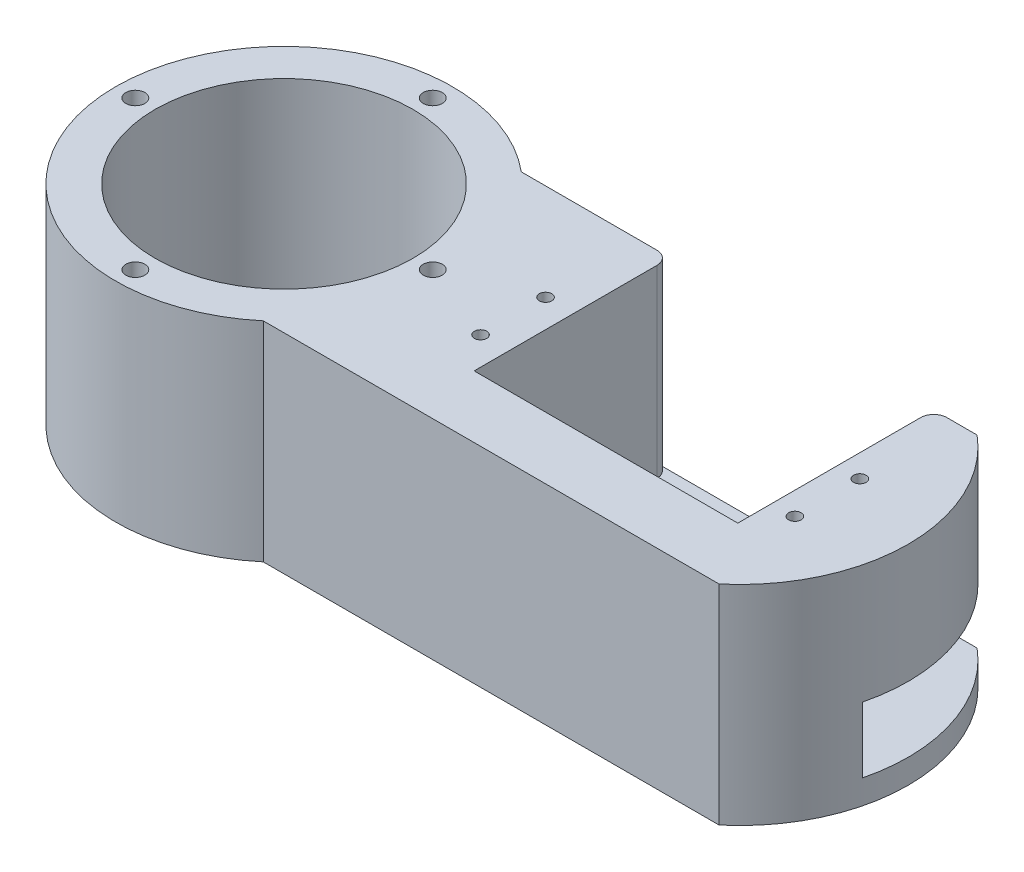
ISO-10303-21;
HEADER;
FILE_DESCRIPTION(('STEP AP214'),'2;1');
FILE_NAME('part.step','',(''),(''),'','','');
FILE_SCHEMA(('AUTOMOTIVE_DESIGN { 1 0 10303 214 1 1 1 1 }'));
ENDSEC;
DATA;
#1=APPLICATION_CONTEXT('core data for automotive mechanical design processes');
#2=APPLICATION_PROTOCOL_DEFINITION('international standard','automotive_design',2000,#1);
#3=PRODUCT_CONTEXT('',#1,'mechanical');
#4=PRODUCT('Part','Part','',(#3));
#5=PRODUCT_RELATED_PRODUCT_CATEGORY('part','',(#4));
#6=PRODUCT_DEFINITION_FORMATION('','',#4);
#7=PRODUCT_DEFINITION_CONTEXT('part definition',#1,'design');
#8=PRODUCT_DEFINITION('design','',#6,#7);
#9=PRODUCT_DEFINITION_SHAPE('','',#8);
#10=(LENGTH_UNIT() NAMED_UNIT(*) SI_UNIT(.MILLI.,.METRE.));
#11=(NAMED_UNIT(*) PLANE_ANGLE_UNIT() SI_UNIT($,.RADIAN.));
#12=(NAMED_UNIT(*) SI_UNIT($,.STERADIAN.) SOLID_ANGLE_UNIT());
#13=UNCERTAINTY_MEASURE_WITH_UNIT(LENGTH_MEASURE(1.E-05),#10,'distance_accuracy_value','');
#14=(GEOMETRIC_REPRESENTATION_CONTEXT(3) GLOBAL_UNCERTAINTY_ASSIGNED_CONTEXT((#13)) GLOBAL_UNIT_ASSIGNED_CONTEXT((#10,
#11,#12)) REPRESENTATION_CONTEXT('',''));
#15=CARTESIAN_POINT('',(0.,0.,0.));
#16=DIRECTION('',(0.,0.,1.));
#17=DIRECTION('',(1.,0.,0.));
#18=AXIS2_PLACEMENT_3D('',#15,#16,#17);
#19=CARTESIAN_POINT('',(0.,31.8,0.));
#20=DIRECTION('',(0.,1.,0.));
#21=DIRECTION('',(0.,0.,1.));
#22=AXIS2_PLACEMENT_3D('',#19,#20,#21);
#23=PLANE('',#22);
#24=DIRECTION('',(1.,0.,0.));
#25=VECTOR('',#24,1.);
#26=CARTESIAN_POINT('',(85.9113579968409,31.8,-19.65));
#27=LINE('',#26,#25);
#28=CARTESIAN_POINT('',(81.31,31.8,-19.65));
#29=VERTEX_POINT('',#28);
#30=CARTESIAN_POINT('',(85.9113579968409,31.8,-19.65));
#31=VERTEX_POINT('',#30);
#32=EDGE_CURVE('E172',#29,#31,#27,.T.);
#33=ORIENTED_EDGE('',*,*,#32,.F.);
#34=CARTESIAN_POINT('',(81.31,31.8,-17.65));
#35=DIRECTION('',(0.,1.,0.));
#36=DIRECTION('',(0.,0.,1.));
#37=AXIS2_PLACEMENT_3D('',#34,#35,#36);
#38=CIRCLE('',#37,2.);
#39=CARTESIAN_POINT('',(79.31,31.8,-17.65));
#40=VERTEX_POINT('',#39);
#41=EDGE_CURVE('E374',#29,#40,#38,.T.);
#42=ORIENTED_EDGE('',*,*,#41,.T.);
#43=DIRECTION('',(0.,0.,-1.));
#44=VECTOR('',#43,1.);
#45=CARTESIAN_POINT('',(79.31,31.8,0.));
#46=LINE('',#45,#44);
#47=CARTESIAN_POINT('',(79.31,31.8,10.195));
#48=VERTEX_POINT('',#47);
#49=EDGE_CURVE('E295',#48,#40,#46,.T.);
#50=ORIENTED_EDGE('',*,*,#49,.F.);
#51=DIRECTION('',(1.,0.,0.));
#52=VECTOR('',#51,1.);
#53=CARTESIAN_POINT('',(0.,31.8,10.195));
#54=LINE('',#53,#52);
#55=CARTESIAN_POINT('',(39.15,31.8,10.195));
#56=VERTEX_POINT('',#55);
#57=EDGE_CURVE('E299',#56,#48,#54,.T.);
#58=ORIENTED_EDGE('',*,*,#57,.F.);
#59=DIRECTION('',(0.,0.,1.));
#60=VECTOR('',#59,1.);
#61=CARTESIAN_POINT('',(39.15,31.8,0.));
#62=LINE('',#61,#60);
#63=CARTESIAN_POINT('',(39.15,31.8,-17.65));
#64=VERTEX_POINT('',#63);
#65=EDGE_CURVE('E292',#64,#56,#62,.T.);
#66=ORIENTED_EDGE('',*,*,#65,.F.);
#67=CARTESIAN_POINT('',(37.15,31.8,-17.65));
#68=DIRECTION('',(0.,1.,0.));
#69=DIRECTION('',(0.,0.,1.));
#70=AXIS2_PLACEMENT_3D('',#67,#68,#69);
#71=CIRCLE('',#70,2.);
#72=CARTESIAN_POINT('',(37.15,31.8,-19.65));
#73=VERTEX_POINT('',#72);
#74=EDGE_CURVE('E371',#64,#73,#71,.T.);
#75=ORIENTED_EDGE('',*,*,#74,.T.);
#76=CARTESIAN_POINT('',(16.4863579968409,31.8,-19.65));
#77=VERTEX_POINT('',#76);
#78=EDGE_CURVE('E169',#77,#73,#27,.T.);
#79=ORIENTED_EDGE('',*,*,#78,.F.);
#80=CARTESIAN_POINT('',(0.,31.8,0.));
#81=DIRECTION('',(0.,1.,0.));
#82=DIRECTION('',(0.,0.,1.));
#83=AXIS2_PLACEMENT_3D('',#80,#81,#82);
#84=CIRCLE('',#83,25.65);
#85=CARTESIAN_POINT('',(16.4863579968409,31.8,19.65));
#86=VERTEX_POINT('',#85);
#87=EDGE_CURVE('E158',#77,#86,#84,.T.);
#88=ORIENTED_EDGE('',*,*,#87,.T.);
#89=DIRECTION('',(-1.,0.,0.));
#90=VECTOR('',#89,1.);
#91=CARTESIAN_POINT('',(85.9113579968409,31.8,19.65));
#92=LINE('',#91,#90);
#93=CARTESIAN_POINT('',(85.9113579968409,31.8,19.65));
#94=VERTEX_POINT('',#93);
#95=EDGE_CURVE('E183',#94,#86,#92,.T.);
#96=ORIENTED_EDGE('',*,*,#95,.F.);
#97=CARTESIAN_POINT('',(69.425,31.8,0.));
#98=DIRECTION('',(0.,1.,0.));
#99=DIRECTION('',(0.,0.,1.));
#100=AXIS2_PLACEMENT_3D('',#97,#98,#99);
#101=CIRCLE('',#100,25.65);
#102=EDGE_CURVE('E281',#94,#31,#101,.T.);
#103=ORIENTED_EDGE('',*,*,#102,.T.);
#104=EDGE_LOOP('',(#33,#42,#50,#58,#66,#75,#79,#88,#96,#103));
#105=FACE_BOUND('',#104,.T.);
#106=CARTESIAN_POINT('',(34.88,31.8,-4.95));
#107=DIRECTION('',(0.,-1.,0.));
#108=DIRECTION('',(0.,0.,-1.));
#109=AXIS2_PLACEMENT_3D('',#106,#107,#108);
#110=CIRCLE('',#109,0.950000000000001);
#111=CARTESIAN_POINT('',(34.88,31.8,-5.9));
#112=VERTEX_POINT('',#111);
#113=EDGE_CURVE('E192',#112,#112,#110,.T.);
#114=ORIENTED_EDGE('',*,*,#113,.T.);
#115=EDGE_LOOP('',(#114));
#116=FACE_BOUND('',#115,.T.);
#117=CARTESIAN_POINT('',(34.88,31.8,4.95));
#118=DIRECTION('',(0.,1.,0.));
#119=DIRECTION('',(0.,0.,1.));
#120=AXIS2_PLACEMENT_3D('',#117,#118,#119);
#121=CIRCLE('',#120,0.950000000000001);
#122=CARTESIAN_POINT('',(34.88,31.8,5.9));
#123=VERTEX_POINT('',#122);
#124=EDGE_CURVE('E196',#123,#123,#121,.T.);
#125=ORIENTED_EDGE('',*,*,#124,.F.);
#126=EDGE_LOOP('',(#125));
#127=FACE_BOUND('',#126,.T.);
#128=CARTESIAN_POINT('',(-22.65,31.8,-1.58164104649594E-13));
#129=DIRECTION('',(0.,1.,0.));
#130=DIRECTION('',(0.,0.,1.));
#131=AXIS2_PLACEMENT_3D('',#128,#129,#130);
#132=CIRCLE('',#131,1.45);
#133=CARTESIAN_POINT('',(-22.65,31.8,1.44999999999984));
#134=VERTEX_POINT('',#133);
#135=EDGE_CURVE('E229',#134,#134,#132,.T.);
#136=ORIENTED_EDGE('',*,*,#135,.F.);
#137=EDGE_LOOP('',(#136));
#138=FACE_BOUND('',#137,.T.);
#139=CARTESIAN_POINT('',(2.37246156974391E-13,31.8,-22.65));
#140=DIRECTION('',(0.,1.,0.));
#141=DIRECTION('',(0.,0.,1.));
#142=AXIS2_PLACEMENT_3D('',#139,#140,#141);
#143=CIRCLE('',#142,1.45);
#144=CARTESIAN_POINT('',(2.37246156974391E-13,31.8,-21.2));
#145=VERTEX_POINT('',#144);
#146=EDGE_CURVE('E233',#145,#145,#143,.T.);
#147=ORIENTED_EDGE('',*,*,#146,.F.);
#148=EDGE_LOOP('',(#147));
#149=FACE_BOUND('',#148,.T.);
#150=CARTESIAN_POINT('',(22.65,31.8,0.));
#151=DIRECTION('',(0.,1.,0.));
#152=DIRECTION('',(0.,0.,1.));
#153=AXIS2_PLACEMENT_3D('',#150,#151,#152);
#154=CIRCLE('',#153,1.45);
#155=CARTESIAN_POINT('',(22.65,31.8,1.45));
#156=VERTEX_POINT('',#155);
#157=EDGE_CURVE('E241',#156,#156,#154,.T.);
#158=ORIENTED_EDGE('',*,*,#157,.F.);
#159=EDGE_LOOP('',(#158));
#160=FACE_BOUND('',#159,.T.);
#161=CARTESIAN_POINT('',(0.,31.8,22.65));
#162=DIRECTION('',(0.,1.,0.));
#163=DIRECTION('',(0.,0.,1.));
#164=AXIS2_PLACEMENT_3D('',#161,#162,#163);
#165=CIRCLE('',#164,1.45);
#166=CARTESIAN_POINT('',(0.,31.8,24.1));
#167=VERTEX_POINT('',#166);
#168=EDGE_CURVE('E249',#167,#167,#165,.T.);
#169=ORIENTED_EDGE('',*,*,#168,.F.);
#170=EDGE_LOOP('',(#169));
#171=FACE_BOUND('',#170,.T.);
#172=CARTESIAN_POINT('',(0.,31.8,0.));
#173=DIRECTION('',(0.,1.,0.));
#174=DIRECTION('',(0.,0.,1.));
#175=AXIS2_PLACEMENT_3D('',#172,#173,#174);
#176=CIRCLE('',#175,19.65);
#177=CARTESIAN_POINT('',(0.,31.8,19.65));
#178=VERTEX_POINT('',#177);
#179=EDGE_CURVE('E288',#178,#178,#176,.T.);
#180=ORIENTED_EDGE('',*,*,#179,.F.);
#181=EDGE_LOOP('',(#180));
#182=FACE_BOUND('',#181,.T.);
#183=CARTESIAN_POINT('',(82.7568756116766,31.8,-4.95000000000001));
#184=DIRECTION('',(0.,1.,0.));
#185=DIRECTION('',(0.,0.,1.));
#186=AXIS2_PLACEMENT_3D('',#183,#184,#185);
#187=CIRCLE('',#186,0.950000000000002);
#188=CARTESIAN_POINT('',(82.7568756116766,31.8,-4.00000000000001));
#189=VERTEX_POINT('',#188);
#190=EDGE_CURVE('E201',#189,#189,#187,.T.);
#191=ORIENTED_EDGE('',*,*,#190,.F.);
#192=EDGE_LOOP('',(#191));
#193=FACE_BOUND('',#192,.T.);
#194=CARTESIAN_POINT('',(82.7568756116766,31.8,4.94999999999999));
#195=DIRECTION('',(0.,-1.,0.));
#196=DIRECTION('',(0.,0.,-1.));
#197=AXIS2_PLACEMENT_3D('',#194,#195,#196);
#198=CIRCLE('',#197,0.950000000000002);
#199=CARTESIAN_POINT('',(82.7568756116766,31.8,3.99999999999999));
#200=VERTEX_POINT('',#199);
#201=EDGE_CURVE('E209',#200,#200,#198,.T.);
#202=ORIENTED_EDGE('',*,*,#201,.T.);
#203=EDGE_LOOP('',(#202));
#204=FACE_BOUND('',#203,.T.);
#205=ADVANCED_FACE('F47',(#105,#116,#127,#138,#149,#160,#171,#182,#193,#204),#23,.T.);
#206=CARTESIAN_POINT('',(0.,3.7,0.));
#207=DIRECTION('',(0.,1.,0.));
#208=DIRECTION('',(0.,0.,1.));
#209=AXIS2_PLACEMENT_3D('',#206,#207,#208);
#210=PLANE('',#209);
#211=CARTESIAN_POINT('',(0.,3.7,0.));
#212=DIRECTION('',(0.,1.,0.));
#213=DIRECTION('',(0.,0.,1.));
#214=AXIS2_PLACEMENT_3D('',#211,#212,#213);
#215=CIRCLE('',#214,19.65);
#216=CARTESIAN_POINT('',(0.,3.7,19.65));
#217=VERTEX_POINT('',#216);
#218=EDGE_CURVE('E340',#217,#217,#215,.F.);
#219=ORIENTED_EDGE('',*,*,#218,.F.);
#220=EDGE_LOOP('',(#219));
#221=FACE_BOUND('',#220,.T.);
#222=CARTESIAN_POINT('',(0.,3.7,0.));
#223=DIRECTION('',(0.,1.,0.));
#224=DIRECTION('',(0.,0.,1.));
#225=AXIS2_PLACEMENT_3D('',#222,#223,#224);
#226=CIRCLE('',#225,4.);
#227=CARTESIAN_POINT('',(0.,3.7,4.));
#228=VERTEX_POINT('',#227);
#229=EDGE_CURVE('E319',#228,#228,#226,.T.);
#230=ORIENTED_EDGE('',*,*,#229,.F.);
#231=EDGE_LOOP('',(#230));
#232=FACE_BOUND('',#231,.T.);
#233=CARTESIAN_POINT('',(16.6,3.7,0.));
#234=DIRECTION('',(0.,1.,0.));
#235=DIRECTION('',(0.,0.,1.));
#236=AXIS2_PLACEMENT_3D('',#233,#234,#235);
#237=CIRCLE('',#236,0.950000000000001);
#238=CARTESIAN_POINT('',(16.6,3.7,0.950000000000001));
#239=VERTEX_POINT('',#238);
#240=EDGE_CURVE('E323',#239,#239,#237,.T.);
#241=ORIENTED_EDGE('',*,*,#240,.F.);
#242=EDGE_LOOP('',(#241));
#243=FACE_BOUND('',#242,.T.);
#244=CARTESIAN_POINT('',(0.,3.7,16.6));
#245=DIRECTION('',(0.,1.,0.));
#246=DIRECTION('',(0.,0.,1.));
#247=AXIS2_PLACEMENT_3D('',#244,#245,#246);
#248=CIRCLE('',#247,0.95);
#249=CARTESIAN_POINT('',(0.,3.7,17.55));
#250=VERTEX_POINT('',#249);
#251=EDGE_CURVE('E328',#250,#250,#248,.T.);
#252=ORIENTED_EDGE('',*,*,#251,.F.);
#253=EDGE_LOOP('',(#252));
#254=FACE_BOUND('',#253,.T.);
#255=CARTESIAN_POINT('',(-16.6,3.7,-1.15917180449592E-13));
#256=DIRECTION('',(0.,1.,0.));
#257=DIRECTION('',(0.,0.,1.));
#258=AXIS2_PLACEMENT_3D('',#255,#256,#257);
#259=CIRCLE('',#258,0.950000000000002);
#260=CARTESIAN_POINT('',(-16.6,3.7,0.949999999999886));
#261=VERTEX_POINT('',#260);
#262=EDGE_CURVE('E332',#261,#261,#259,.T.);
#263=ORIENTED_EDGE('',*,*,#262,.F.);
#264=EDGE_LOOP('',(#263));
#265=FACE_BOUND('',#264,.T.);
#266=CARTESIAN_POINT('',(1.73875770674388E-13,3.7,-16.6));
#267=DIRECTION('',(0.,1.,0.));
#268=DIRECTION('',(0.,0.,1.));
#269=AXIS2_PLACEMENT_3D('',#266,#267,#268);
#270=CIRCLE('',#269,0.950000000000001);
#271=CARTESIAN_POINT('',(1.73875770674388E-13,3.7,-15.65));
#272=VERTEX_POINT('',#271);
#273=EDGE_CURVE('E336',#272,#272,#270,.T.);
#274=ORIENTED_EDGE('',*,*,#273,.F.);
#275=EDGE_LOOP('',(#274));
#276=FACE_BOUND('',#275,.T.);
#277=ADVANCED_FACE('F443',(#221,#232,#243,#254,#265,#276),#210,.T.);
#278=CARTESIAN_POINT('',(69.425,3.7,0.));
#279=DIRECTION('',(0.,-1.,0.));
#280=DIRECTION('',(0.,0.,-1.));
#281=AXIS2_PLACEMENT_3D('',#278,#279,#280);
#282=CYLINDRICAL_SURFACE('',#281,25.65);
#283=DIRECTION('',(0.,1.,0.));
#284=VECTOR('',#283,1.);
#285=CARTESIAN_POINT('',(85.9113579968409,0.,-19.65));
#286=LINE('',#285,#284);
#287=CARTESIAN_POINT('',(85.9113579968409,13.7,-19.65));
#288=VERTEX_POINT('',#287);
#289=EDGE_CURVE('E163',#288,#31,#286,.T.);
#290=ORIENTED_EDGE('',*,*,#289,.T.);
#291=ORIENTED_EDGE('',*,*,#102,.F.);
#292=DIRECTION('',(0.,1.,0.));
#293=VECTOR('',#292,1.);
#294=CARTESIAN_POINT('',(85.9113579968409,0.,19.65));
#295=LINE('',#294,#293);
#296=CARTESIAN_POINT('',(85.9113579968409,0.,19.65));
#297=VERTEX_POINT('',#296);
#298=EDGE_CURVE('E177',#297,#94,#295,.T.);
#299=ORIENTED_EDGE('',*,*,#298,.F.);
#300=CARTESIAN_POINT('',(69.425,0.,0.));
#301=DIRECTION('',(0.,1.,0.));
#302=DIRECTION('',(0.,0.,1.));
#303=AXIS2_PLACEMENT_3D('',#300,#301,#302);
#304=CIRCLE('',#303,25.65);
#305=CARTESIAN_POINT('',(85.9113579968409,0.,-19.65));
#306=VERTEX_POINT('',#305);
#307=EDGE_CURVE('E153',#306,#297,#304,.F.);
#308=ORIENTED_EDGE('',*,*,#307,.F.);
#309=CARTESIAN_POINT('',(85.9113579968409,3.7,-19.65));
#310=VERTEX_POINT('',#309);
#311=EDGE_CURVE('E167',#306,#310,#286,.T.);
#312=ORIENTED_EDGE('',*,*,#311,.T.);
#313=CARTESIAN_POINT('',(69.425,3.7,0.));
#314=DIRECTION('',(0.,-1.,0.));
#315=DIRECTION('',(0.,0.,-1.));
#316=AXIS2_PLACEMENT_3D('',#313,#314,#315);
#317=CIRCLE('',#316,25.65);
#318=CARTESIAN_POINT('',(94.3156503530944,3.7,6.195));
#319=VERTEX_POINT('',#318);
#320=EDGE_CURVE('E275',#310,#319,#317,.T.);
#321=ORIENTED_EDGE('',*,*,#320,.T.);
#322=DIRECTION('',(0.,-1.,0.));
#323=VECTOR('',#322,1.);
#324=CARTESIAN_POINT('',(94.3156503530944,3.7,6.195));
#325=LINE('',#324,#323);
#326=CARTESIAN_POINT('',(94.3156503530944,13.7,6.195));
#327=VERTEX_POINT('',#326);
#328=EDGE_CURVE('E259',#319,#327,#325,.F.);
#329=ORIENTED_EDGE('',*,*,#328,.T.);
#330=CARTESIAN_POINT('',(69.425,13.7,0.));
#331=DIRECTION('',(0.,1.,0.));
#332=DIRECTION('',(0.,0.,1.));
#333=AXIS2_PLACEMENT_3D('',#330,#331,#332);
#334=CIRCLE('',#333,25.65);
#335=EDGE_CURVE('E228',#327,#288,#334,.T.);
#336=ORIENTED_EDGE('',*,*,#335,.T.);
#337=EDGE_LOOP('',(#290,#291,#299,#308,#312,#321,#329,#336));
#338=FACE_BOUND('',#337,.T.);
#339=ADVANCED_FACE('F407',(#338),#282,.T.);
#340=CARTESIAN_POINT('',(0.,3.7,0.));
#341=DIRECTION('',(0.,-1.,0.));
#342=DIRECTION('',(0.,0.,-1.));
#343=AXIS2_PLACEMENT_3D('',#340,#341,#342);
#344=CYLINDRICAL_SURFACE('',#343,25.65);
#345=CARTESIAN_POINT('',(0.,0.,0.));
#346=DIRECTION('',(0.,1.,0.));
#347=DIRECTION('',(0.,0.,1.));
#348=AXIS2_PLACEMENT_3D('',#345,#346,#347);
#349=CIRCLE('',#348,25.65);
#350=CARTESIAN_POINT('',(16.4863579968409,0.,-19.65));
#351=VERTEX_POINT('',#350);
#352=CARTESIAN_POINT('',(16.4863579968409,0.,19.65));
#353=VERTEX_POINT('',#352);
#354=EDGE_CURVE('E139',#351,#353,#349,.T.);
#355=ORIENTED_EDGE('',*,*,#354,.T.);
#356=DIRECTION('',(0.,1.,0.));
#357=VECTOR('',#356,1.);
#358=CARTESIAN_POINT('',(16.4863579968409,0.,19.65));
#359=LINE('',#358,#357);
#360=EDGE_CURVE('E180',#353,#86,#359,.T.);
#361=ORIENTED_EDGE('',*,*,#360,.T.);
#362=ORIENTED_EDGE('',*,*,#87,.F.);
#363=DIRECTION('',(0.,1.,0.));
#364=VECTOR('',#363,1.);
#365=CARTESIAN_POINT('',(16.4863579968409,0.,-19.65));
#366=LINE('',#365,#364);
#367=EDGE_CURVE('E156',#351,#77,#366,.T.);
#368=ORIENTED_EDGE('',*,*,#367,.F.);
#369=EDGE_LOOP('',(#355,#361,#362,#368));
#370=FACE_BOUND('',#369,.T.);
#371=ADVANCED_FACE('F157',(#370),#344,.T.);
#372=CARTESIAN_POINT('',(-16.6,3.7,-1.15917180449592E-13));
#373=DIRECTION('',(0.,-1.,0.));
#374=DIRECTION('',(0.,0.,-1.));
#375=AXIS2_PLACEMENT_3D('',#372,#373,#374);
#376=CYLINDRICAL_SURFACE('',#375,0.950000000000002);
#377=ORIENTED_EDGE('',*,*,#262,.T.);
#378=EDGE_LOOP('',(#377));
#379=FACE_BOUND('',#378,.T.);
#380=CARTESIAN_POINT('',(-16.6,0.,-1.15917180449592E-13));
#381=DIRECTION('',(0.,1.,0.));
#382=DIRECTION('',(0.,0.,1.));
#383=AXIS2_PLACEMENT_3D('',#380,#381,#382);
#384=CIRCLE('',#383,0.950000000000002);
#385=CARTESIAN_POINT('',(-16.6,0.,0.949999999999886));
#386=VERTEX_POINT('',#385);
#387=EDGE_CURVE('E354',#386,#386,#384,.T.);
#388=ORIENTED_EDGE('',*,*,#387,.F.);
#389=EDGE_LOOP('',(#388));
#390=FACE_BOUND('',#389,.T.);
#391=ADVANCED_FACE('F736',(#379,#390),#376,.F.);
#392=CARTESIAN_POINT('',(0.,3.7,16.6));
#393=DIRECTION('',(0.,-1.,0.));
#394=DIRECTION('',(0.,0.,-1.));
#395=AXIS2_PLACEMENT_3D('',#392,#393,#394);
#396=CYLINDRICAL_SURFACE('',#395,0.95);
#397=ORIENTED_EDGE('',*,*,#251,.T.);
#398=EDGE_LOOP('',(#397));
#399=FACE_BOUND('',#398,.T.);
#400=CARTESIAN_POINT('',(0.,0.,16.6));
#401=DIRECTION('',(0.,1.,0.));
#402=DIRECTION('',(0.,0.,1.));
#403=AXIS2_PLACEMENT_3D('',#400,#401,#402);
#404=CIRCLE('',#403,0.95);
#405=CARTESIAN_POINT('',(0.,0.,17.55));
#406=VERTEX_POINT('',#405);
#407=EDGE_CURVE('E350',#406,#406,#404,.T.);
#408=ORIENTED_EDGE('',*,*,#407,.F.);
#409=EDGE_LOOP('',(#408));
#410=FACE_BOUND('',#409,.T.);
#411=ADVANCED_FACE('F727',(#399,#410),#396,.F.);
#412=CARTESIAN_POINT('',(16.6,3.7,0.));
#413=DIRECTION('',(0.,-1.,0.));
#414=DIRECTION('',(0.,0.,-1.));
#415=AXIS2_PLACEMENT_3D('',#412,#413,#414);
#416=CYLINDRICAL_SURFACE('',#415,0.950000000000001);
#417=ORIENTED_EDGE('',*,*,#240,.T.);
#418=EDGE_LOOP('',(#417));
#419=FACE_BOUND('',#418,.T.);
#420=CARTESIAN_POINT('',(16.6,0.,0.));
#421=DIRECTION('',(0.,1.,0.));
#422=DIRECTION('',(0.,0.,1.));
#423=AXIS2_PLACEMENT_3D('',#420,#421,#422);
#424=CIRCLE('',#423,0.950000000000001);
#425=CARTESIAN_POINT('',(16.6,0.,0.950000000000001));
#426=VERTEX_POINT('',#425);
#427=EDGE_CURVE('E346',#426,#426,#424,.T.);
#428=ORIENTED_EDGE('',*,*,#427,.F.);
#429=EDGE_LOOP('',(#428));
#430=FACE_BOUND('',#429,.T.);
#431=ADVANCED_FACE('F718',(#419,#430),#416,.F.);
#432=CARTESIAN_POINT('',(0.,3.7,0.));
#433=DIRECTION('',(0.,-1.,0.));
#434=DIRECTION('',(0.,0.,-1.));
#435=AXIS2_PLACEMENT_3D('',#432,#433,#434);
#436=CYLINDRICAL_SURFACE('',#435,4.);
#437=ORIENTED_EDGE('',*,*,#229,.T.);
#438=EDGE_LOOP('',(#437));
#439=FACE_BOUND('',#438,.T.);
#440=CARTESIAN_POINT('',(0.,0.,0.));
#441=DIRECTION('',(0.,1.,0.));
#442=DIRECTION('',(0.,0.,1.));
#443=AXIS2_PLACEMENT_3D('',#440,#441,#442);
#444=CIRCLE('',#443,4.);
#445=CARTESIAN_POINT('',(0.,0.,4.));
#446=VERTEX_POINT('',#445);
#447=EDGE_CURVE('E152',#446,#446,#444,.T.);
#448=ORIENTED_EDGE('',*,*,#447,.F.);
#449=EDGE_LOOP('',(#448));
#450=FACE_BOUND('',#449,.T.);
#451=ADVANCED_FACE('F709',(#439,#450),#436,.F.);
#452=CARTESIAN_POINT('',(1.73875770674388E-13,3.7,-16.6));
#453=DIRECTION('',(0.,-1.,0.));
#454=DIRECTION('',(0.,0.,-1.));
#455=AXIS2_PLACEMENT_3D('',#452,#453,#454);
#456=CYLINDRICAL_SURFACE('',#455,0.950000000000001);
#457=ORIENTED_EDGE('',*,*,#273,.T.);
#458=EDGE_LOOP('',(#457));
#459=FACE_BOUND('',#458,.T.);
#460=CARTESIAN_POINT('',(1.73875770674388E-13,0.,-16.6));
#461=DIRECTION('',(0.,1.,0.));
#462=DIRECTION('',(0.,0.,1.));
#463=AXIS2_PLACEMENT_3D('',#460,#461,#462);
#464=CIRCLE('',#463,0.950000000000001);
#465=CARTESIAN_POINT('',(1.73875770674388E-13,0.,-15.65));
#466=VERTEX_POINT('',#465);
#467=EDGE_CURVE('E324',#466,#466,#464,.T.);
#468=ORIENTED_EDGE('',*,*,#467,.F.);
#469=EDGE_LOOP('',(#468));
#470=FACE_BOUND('',#469,.T.);
#471=ADVANCED_FACE('F694',(#459,#470),#456,.F.);
#472=CARTESIAN_POINT('',(0.,0.,0.));
#473=DIRECTION('',(0.,1.,0.));
#474=DIRECTION('',(0.,0.,1.));
#475=AXIS2_PLACEMENT_3D('',#472,#473,#474);
#476=PLANE('',#475);
#477=ORIENTED_EDGE('',*,*,#354,.F.);
#478=DIRECTION('',(1.,0.,0.));
#479=VECTOR('',#478,1.);
#480=CARTESIAN_POINT('',(85.9113579968409,0.,-19.65));
#481=LINE('',#480,#479);
#482=EDGE_CURVE('E145',#351,#306,#481,.T.);
#483=ORIENTED_EDGE('',*,*,#482,.T.);
#484=ORIENTED_EDGE('',*,*,#307,.T.);
#485=DIRECTION('',(-1.,0.,0.));
#486=VECTOR('',#485,1.);
#487=CARTESIAN_POINT('',(85.9113579968409,0.,19.65));
#488=LINE('',#487,#486);
#489=EDGE_CURVE('E147',#297,#353,#488,.T.);
#490=ORIENTED_EDGE('',*,*,#489,.T.);
#491=EDGE_LOOP('',(#477,#483,#484,#490));
#492=FACE_BOUND('',#491,.T.);
#493=ORIENTED_EDGE('',*,*,#447,.T.);
#494=EDGE_LOOP('',(#493));
#495=FACE_BOUND('',#494,.T.);
#496=ORIENTED_EDGE('',*,*,#427,.T.);
#497=EDGE_LOOP('',(#496));
#498=FACE_BOUND('',#497,.T.);
#499=ORIENTED_EDGE('',*,*,#407,.T.);
#500=EDGE_LOOP('',(#499));
#501=FACE_BOUND('',#500,.T.);
#502=ORIENTED_EDGE('',*,*,#387,.T.);
#503=EDGE_LOOP('',(#502));
#504=FACE_BOUND('',#503,.T.);
#505=ORIENTED_EDGE('',*,*,#467,.T.);
#506=EDGE_LOOP('',(#505));
#507=FACE_BOUND('',#506,.T.);
#508=ADVANCED_FACE('F141',(#492,#495,#498,#501,#504,#507),#476,.F.);
#509=CARTESIAN_POINT('',(39.15,31.8,0.));
#510=DIRECTION('',(1.,0.,0.));
#511=DIRECTION('',(0.,0.,-1.));
#512=AXIS2_PLACEMENT_3D('',#509,#510,#511);
#513=PLANE('',#512);
#514=DIRECTION('',(0.,0.,1.));
#515=VECTOR('',#514,1.);
#516=CARTESIAN_POINT('',(39.15,3.7,0.));
#517=LINE('',#516,#515);
#518=CARTESIAN_POINT('',(39.15,3.7,-17.65));
#519=VERTEX_POINT('',#518);
#520=CARTESIAN_POINT('',(39.15,3.7,10.195));
#521=VERTEX_POINT('',#520);
#522=EDGE_CURVE('E280',#519,#521,#517,.T.);
#523=ORIENTED_EDGE('',*,*,#522,.F.);
#524=DIRECTION('',(0.,-1.,0.));
#525=VECTOR('',#524,1.);
#526=CARTESIAN_POINT('',(39.15,31.8,-17.65));
#527=LINE('',#526,#525);
#528=EDGE_CURVE('E56',#519,#64,#527,.F.);
#529=ORIENTED_EDGE('',*,*,#528,.T.);
#530=ORIENTED_EDGE('',*,*,#65,.T.);
#531=DIRECTION('',(0.,-1.,0.));
#532=VECTOR('',#531,1.);
#533=CARTESIAN_POINT('',(39.15,31.8,10.195));
#534=LINE('',#533,#532);
#535=EDGE_CURVE('E303',#56,#521,#534,.T.);
#536=ORIENTED_EDGE('',*,*,#535,.T.);
#537=EDGE_LOOP('',(#523,#529,#530,#536));
#538=FACE_BOUND('',#537,.T.);
#539=ADVANCED_FACE('F390',(#538),#513,.T.);
#540=CARTESIAN_POINT('',(79.31,31.8,0.));
#541=DIRECTION('',(-1.,0.,0.));
#542=DIRECTION('',(0.,0.,1.));
#543=AXIS2_PLACEMENT_3D('',#540,#541,#542);
#544=PLANE('',#543);
#545=ORIENTED_EDGE('',*,*,#49,.T.);
#546=DIRECTION('',(0.,1.,0.));
#547=VECTOR('',#546,1.);
#548=CARTESIAN_POINT('',(79.31,13.7,-17.65));
#549=LINE('',#548,#547);
#550=CARTESIAN_POINT('',(79.31,13.7,-17.65));
#551=VERTEX_POINT('',#550);
#552=EDGE_CURVE('E377',#40,#551,#549,.F.);
#553=ORIENTED_EDGE('',*,*,#552,.T.);
#554=DIRECTION('',(0.,0.,-1.));
#555=VECTOR('',#554,1.);
#556=CARTESIAN_POINT('',(79.31,13.7,6.195));
#557=LINE('',#556,#555);
#558=CARTESIAN_POINT('',(79.31,13.7,6.195));
#559=VERTEX_POINT('',#558);
#560=EDGE_CURVE('E267',#559,#551,#557,.T.);
#561=ORIENTED_EDGE('',*,*,#560,.F.);
#562=DIRECTION('',(0.,1.,0.));
#563=VECTOR('',#562,1.);
#564=CARTESIAN_POINT('',(79.31,3.7,6.195));
#565=LINE('',#564,#563);
#566=CARTESIAN_POINT('',(79.31,3.7,6.195));
#567=VERTEX_POINT('',#566);
#568=EDGE_CURVE('E263',#567,#559,#565,.T.);
#569=ORIENTED_EDGE('',*,*,#568,.F.);
#570=DIRECTION('',(0.,0.,-1.));
#571=VECTOR('',#570,1.);
#572=CARTESIAN_POINT('',(79.31,3.7,0.));
#573=LINE('',#572,#571);
#574=CARTESIAN_POINT('',(79.31,3.7,10.195));
#575=VERTEX_POINT('',#574);
#576=EDGE_CURVE('E306',#575,#567,#573,.T.);
#577=ORIENTED_EDGE('',*,*,#576,.F.);
#578=DIRECTION('',(0.,-1.,0.));
#579=VECTOR('',#578,1.);
#580=CARTESIAN_POINT('',(79.31,31.8,10.195));
#581=LINE('',#580,#579);
#582=EDGE_CURVE('E315',#48,#575,#581,.T.);
#583=ORIENTED_EDGE('',*,*,#582,.F.);
#584=EDGE_LOOP('',(#545,#553,#561,#569,#577,#583));
#585=FACE_BOUND('',#584,.T.);
#586=ADVANCED_FACE('F420',(#585),#544,.T.);
#587=CARTESIAN_POINT('',(0.,31.8,0.));
#588=DIRECTION('',(0.,-1.,0.));
#589=DIRECTION('',(0.,0.,-1.));
#590=AXIS2_PLACEMENT_3D('',#587,#588,#589);
#591=CYLINDRICAL_SURFACE('',#590,19.65);
#592=ORIENTED_EDGE('',*,*,#179,.T.);
#593=EDGE_LOOP('',(#592));
#594=FACE_BOUND('',#593,.T.);
#595=ORIENTED_EDGE('',*,*,#218,.T.);
#596=EDGE_LOOP('',(#595));
#597=FACE_BOUND('',#596,.T.);
#598=ADVANCED_FACE('F435',(#594,#597),#591,.F.);
#599=CARTESIAN_POINT('',(0.,31.8,10.195));
#600=DIRECTION('',(0.,0.,-1.));
#601=DIRECTION('',(-1.,0.,0.));
#602=AXIS2_PLACEMENT_3D('',#599,#600,#601);
#603=PLANE('',#602);
#604=DIRECTION('',(1.,0.,0.));
#605=VECTOR('',#604,1.);
#606=CARTESIAN_POINT('',(0.,3.7,10.195));
#607=LINE('',#606,#605);
#608=EDGE_CURVE('E285',#521,#575,#607,.T.);
#609=ORIENTED_EDGE('',*,*,#608,.F.);
#610=ORIENTED_EDGE('',*,*,#535,.F.);
#611=ORIENTED_EDGE('',*,*,#57,.T.);
#612=ORIENTED_EDGE('',*,*,#582,.T.);
#613=EDGE_LOOP('',(#609,#610,#611,#612));
#614=FACE_BOUND('',#613,.T.);
#615=ADVANCED_FACE('F433',(#614),#603,.T.);
#616=DIRECTION('',(1.,0.,0.));
#617=VECTOR('',#616,1.);
#618=CARTESIAN_POINT('',(0.,3.7,-19.65));
#619=LINE('',#618,#617);
#620=CARTESIAN_POINT('',(37.15,3.7,-19.65));
#621=VERTEX_POINT('',#620);
#622=EDGE_CURVE('E66',#621,#310,#619,.T.);
#623=ORIENTED_EDGE('',*,*,#622,.F.);
#624=CARTESIAN_POINT('',(37.15,3.7,-17.65));
#625=DIRECTION('',(0.,1.,0.));
#626=DIRECTION('',(0.,0.,1.));
#627=AXIS2_PLACEMENT_3D('',#624,#625,#626);
#628=CIRCLE('',#627,2.);
#629=EDGE_CURVE('E11',#621,#519,#628,.F.);
#630=ORIENTED_EDGE('',*,*,#629,.T.);
#631=ORIENTED_EDGE('',*,*,#522,.T.);
#632=ORIENTED_EDGE('',*,*,#608,.T.);
#633=ORIENTED_EDGE('',*,*,#576,.T.);
#634=DIRECTION('',(-1.,0.,0.));
#635=VECTOR('',#634,1.);
#636=CARTESIAN_POINT('',(95.076,3.7,6.195));
#637=LINE('',#636,#635);
#638=EDGE_CURVE('E272',#319,#567,#637,.T.);
#639=ORIENTED_EDGE('',*,*,#638,.F.);
#640=ORIENTED_EDGE('',*,*,#320,.F.);
#641=EDGE_LOOP('',(#623,#630,#631,#632,#633,#639,#640));
#642=FACE_BOUND('',#641,.T.);
#643=ADVANCED_FACE('F430',(#642),#210,.T.);
#644=CARTESIAN_POINT('',(95.076,3.7,6.195));
#645=DIRECTION('',(0.,0.,1.));
#646=DIRECTION('',(1.,0.,0.));
#647=AXIS2_PLACEMENT_3D('',#644,#645,#646);
#648=PLANE('',#647);
#649=ORIENTED_EDGE('',*,*,#638,.T.);
#650=ORIENTED_EDGE('',*,*,#568,.T.);
#651=DIRECTION('',(-1.,0.,0.));
#652=VECTOR('',#651,1.);
#653=CARTESIAN_POINT('',(95.076,13.7,6.195));
#654=LINE('',#653,#652);
#655=EDGE_CURVE('E271',#327,#559,#654,.T.);
#656=ORIENTED_EDGE('',*,*,#655,.F.);
#657=ORIENTED_EDGE('',*,*,#328,.F.);
#658=EDGE_LOOP('',(#649,#650,#656,#657));
#659=FACE_BOUND('',#658,.T.);
#660=ADVANCED_FACE('F427',(#659),#648,.F.);
#661=CARTESIAN_POINT('',(95.076,13.7,6.195));
#662=DIRECTION('',(0.,1.,0.));
#663=DIRECTION('',(0.,0.,1.));
#664=AXIS2_PLACEMENT_3D('',#661,#662,#663);
#665=PLANE('',#664);
#666=ORIENTED_EDGE('',*,*,#560,.T.);
#667=CARTESIAN_POINT('',(81.31,13.7,-17.65));
#668=DIRECTION('',(0.,1.,0.));
#669=DIRECTION('',(0.,0.,1.));
#670=AXIS2_PLACEMENT_3D('',#667,#668,#669);
#671=CIRCLE('',#670,2.);
#672=CARTESIAN_POINT('',(81.31,13.7,-19.65));
#673=VERTEX_POINT('',#672);
#674=EDGE_CURVE('E380',#551,#673,#671,.F.);
#675=ORIENTED_EDGE('',*,*,#674,.T.);
#676=DIRECTION('',(1.,0.,0.));
#677=VECTOR('',#676,1.);
#678=CARTESIAN_POINT('',(95.076,13.7,-19.65));
#679=LINE('',#678,#677);
#680=EDGE_CURVE('E364',#673,#288,#679,.T.);
#681=ORIENTED_EDGE('',*,*,#680,.T.);
#682=ORIENTED_EDGE('',*,*,#335,.F.);
#683=ORIENTED_EDGE('',*,*,#655,.T.);
#684=EDGE_LOOP('',(#666,#675,#681,#682,#683));
#685=FACE_BOUND('',#684,.T.);
#686=ADVANCED_FACE('F423',(#685),#665,.F.);
#687=CARTESIAN_POINT('',(0.,16.8,22.65));
#688=DIRECTION('',(0.,1.,0.));
#689=DIRECTION('',(0.,0.,1.));
#690=AXIS2_PLACEMENT_3D('',#687,#688,#689);
#691=CYLINDRICAL_SURFACE('',#690,1.45);
#692=CARTESIAN_POINT('',(0.,16.8,22.65));
#693=DIRECTION('',(0.,1.,0.));
#694=DIRECTION('',(0.,0.,1.));
#695=AXIS2_PLACEMENT_3D('',#692,#693,#694);
#696=CIRCLE('',#695,1.45);
#697=CARTESIAN_POINT('',(0.,16.8,24.1));
#698=VERTEX_POINT('',#697);
#699=EDGE_CURVE('E220',#698,#698,#696,.T.);
#700=ORIENTED_EDGE('',*,*,#699,.F.);
#701=EDGE_LOOP('',(#700));
#702=FACE_BOUND('',#701,.T.);
#703=ORIENTED_EDGE('',*,*,#168,.T.);
#704=EDGE_LOOP('',(#703));
#705=FACE_BOUND('',#704,.T.);
#706=ADVANCED_FACE('F459',(#702,#705),#691,.F.);
#707=CARTESIAN_POINT('',(0.,16.8,22.65));
#708=DIRECTION('',(0.,1.,0.));
#709=DIRECTION('',(0.,0.,1.));
#710=AXIS2_PLACEMENT_3D('',#707,#708,#709);
#711=PLANE('',#710);
#712=ORIENTED_EDGE('',*,*,#699,.T.);
#713=EDGE_LOOP('',(#712));
#714=FACE_BOUND('',#713,.T.);
#715=ADVANCED_FACE('F460',(#714),#711,.T.);
#716=CARTESIAN_POINT('',(22.65,16.8,0.));
#717=DIRECTION('',(0.,1.,0.));
#718=DIRECTION('',(0.,0.,1.));
#719=AXIS2_PLACEMENT_3D('',#716,#717,#718);
#720=CYLINDRICAL_SURFACE('',#719,1.45);
#721=CARTESIAN_POINT('',(22.65,16.8,0.));
#722=DIRECTION('',(0.,1.,0.));
#723=DIRECTION('',(0.,0.,1.));
#724=AXIS2_PLACEMENT_3D('',#721,#722,#723);
#725=CIRCLE('',#724,1.45);
#726=CARTESIAN_POINT('',(22.65,16.8,1.45));
#727=VERTEX_POINT('',#726);
#728=EDGE_CURVE('E245',#727,#727,#725,.T.);
#729=ORIENTED_EDGE('',*,*,#728,.F.);
#730=EDGE_LOOP('',(#729));
#731=FACE_BOUND('',#730,.T.);
#732=ORIENTED_EDGE('',*,*,#157,.T.);
#733=EDGE_LOOP('',(#732));
#734=FACE_BOUND('',#733,.T.);
#735=ADVANCED_FACE('F463',(#731,#734),#720,.F.);
#736=CARTESIAN_POINT('',(22.65,16.8,0.));
#737=DIRECTION('',(0.,1.,0.));
#738=DIRECTION('',(0.,0.,1.));
#739=AXIS2_PLACEMENT_3D('',#736,#737,#738);
#740=PLANE('',#739);
#741=ORIENTED_EDGE('',*,*,#728,.T.);
#742=EDGE_LOOP('',(#741));
#743=FACE_BOUND('',#742,.T.);
#744=ADVANCED_FACE('F468',(#743),#740,.T.);
#745=CARTESIAN_POINT('',(2.37246156974391E-13,16.8,-22.65));
#746=DIRECTION('',(0.,1.,0.));
#747=DIRECTION('',(0.,0.,1.));
#748=AXIS2_PLACEMENT_3D('',#745,#746,#747);
#749=CYLINDRICAL_SURFACE('',#748,1.45);
#750=CARTESIAN_POINT('',(2.37246156974391E-13,16.8,-22.65));
#751=DIRECTION('',(0.,1.,0.));
#752=DIRECTION('',(0.,0.,1.));
#753=AXIS2_PLACEMENT_3D('',#750,#751,#752);
#754=CIRCLE('',#753,1.45);
#755=CARTESIAN_POINT('',(2.37246156974391E-13,16.8,-21.2));
#756=VERTEX_POINT('',#755);
#757=EDGE_CURVE('E237',#756,#756,#754,.T.);
#758=ORIENTED_EDGE('',*,*,#757,.F.);
#759=EDGE_LOOP('',(#758));
#760=FACE_BOUND('',#759,.T.);
#761=ORIENTED_EDGE('',*,*,#146,.T.);
#762=EDGE_LOOP('',(#761));
#763=FACE_BOUND('',#762,.T.);
#764=ADVANCED_FACE('F471',(#760,#763),#749,.F.);
#765=CARTESIAN_POINT('',(2.37246156974391E-13,16.8,-22.65));
#766=DIRECTION('',(0.,1.,0.));
#767=DIRECTION('',(0.,0.,1.));
#768=AXIS2_PLACEMENT_3D('',#765,#766,#767);
#769=PLANE('',#768);
#770=ORIENTED_EDGE('',*,*,#757,.T.);
#771=EDGE_LOOP('',(#770));
#772=FACE_BOUND('',#771,.T.);
#773=ADVANCED_FACE('F476',(#772),#769,.T.);
#774=CARTESIAN_POINT('',(-22.65,16.8,-1.58164104649594E-13));
#775=DIRECTION('',(0.,1.,0.));
#776=DIRECTION('',(0.,0.,1.));
#777=AXIS2_PLACEMENT_3D('',#774,#775,#776);
#778=CYLINDRICAL_SURFACE('',#777,1.45);
#779=CARTESIAN_POINT('',(-22.65,16.8,-1.58164104649594E-13));
#780=DIRECTION('',(0.,1.,0.));
#781=DIRECTION('',(0.,0.,1.));
#782=AXIS2_PLACEMENT_3D('',#779,#780,#781);
#783=CIRCLE('',#782,1.45);
#784=CARTESIAN_POINT('',(-22.65,16.8,1.44999999999984));
#785=VERTEX_POINT('',#784);
#786=EDGE_CURVE('E224',#785,#785,#783,.T.);
#787=ORIENTED_EDGE('',*,*,#786,.F.);
#788=EDGE_LOOP('',(#787));
#789=FACE_BOUND('',#788,.T.);
#790=ORIENTED_EDGE('',*,*,#135,.T.);
#791=EDGE_LOOP('',(#790));
#792=FACE_BOUND('',#791,.T.);
#793=ADVANCED_FACE('F479',(#789,#792),#778,.F.);
#794=CARTESIAN_POINT('',(-22.65,16.8,-1.58164104649594E-13));
#795=DIRECTION('',(0.,1.,0.));
#796=DIRECTION('',(0.,0.,1.));
#797=AXIS2_PLACEMENT_3D('',#794,#795,#796);
#798=PLANE('',#797);
#799=ORIENTED_EDGE('',*,*,#786,.T.);
#800=EDGE_LOOP('',(#799));
#801=FACE_BOUND('',#800,.T.);
#802=ADVANCED_FACE('F486',(#801),#798,.T.);
#803=CARTESIAN_POINT('',(34.88,19.8,4.95));
#804=DIRECTION('',(0.,1.,0.));
#805=DIRECTION('',(0.,0.,1.));
#806=AXIS2_PLACEMENT_3D('',#803,#804,#805);
#807=CYLINDRICAL_SURFACE('',#806,0.950000000000001);
#808=CARTESIAN_POINT('',(34.88,19.8,4.95));
#809=DIRECTION('',(0.,1.,0.));
#810=DIRECTION('',(0.,0.,1.));
#811=AXIS2_PLACEMENT_3D('',#808,#809,#810);
#812=CIRCLE('',#811,0.950000000000001);
#813=CARTESIAN_POINT('',(34.88,19.8,5.9));
#814=VERTEX_POINT('',#813);
#815=EDGE_CURVE('E216',#814,#814,#812,.T.);
#816=ORIENTED_EDGE('',*,*,#815,.F.);
#817=EDGE_LOOP('',(#816));
#818=FACE_BOUND('',#817,.T.);
#819=ORIENTED_EDGE('',*,*,#124,.T.);
#820=EDGE_LOOP('',(#819));
#821=FACE_BOUND('',#820,.T.);
#822=ADVANCED_FACE('F490',(#818,#821),#807,.F.);
#823=CARTESIAN_POINT('',(34.88,19.8,4.95));
#824=DIRECTION('',(0.,1.,0.));
#825=DIRECTION('',(0.,0.,1.));
#826=AXIS2_PLACEMENT_3D('',#823,#824,#825);
#827=PLANE('',#826);
#828=ORIENTED_EDGE('',*,*,#815,.T.);
#829=EDGE_LOOP('',(#828));
#830=FACE_BOUND('',#829,.T.);
#831=ADVANCED_FACE('F494',(#830),#827,.T.);
#832=CARTESIAN_POINT('',(34.88,19.8,-4.95));
#833=DIRECTION('',(0.,1.,0.));
#834=DIRECTION('',(0.,0.,1.));
#835=AXIS2_PLACEMENT_3D('',#832,#833,#834);
#836=CYLINDRICAL_SURFACE('',#835,0.950000000000001);
#837=CARTESIAN_POINT('',(34.88,19.8,-4.95));
#838=DIRECTION('',(0.,-1.,0.));
#839=DIRECTION('',(0.,0.,-1.));
#840=AXIS2_PLACEMENT_3D('',#837,#838,#839);
#841=CIRCLE('',#840,0.950000000000001);
#842=CARTESIAN_POINT('',(34.88,19.8,-5.9));
#843=VERTEX_POINT('',#842);
#844=EDGE_CURVE('E197',#843,#843,#841,.T.);
#845=ORIENTED_EDGE('',*,*,#844,.T.);
#846=EDGE_LOOP('',(#845));
#847=FACE_BOUND('',#846,.T.);
#848=ORIENTED_EDGE('',*,*,#113,.F.);
#849=EDGE_LOOP('',(#848));
#850=FACE_BOUND('',#849,.T.);
#851=ADVANCED_FACE('F498',(#847,#850),#836,.F.);
#852=CARTESIAN_POINT('',(34.88,19.8,-4.95));
#853=DIRECTION('',(0.,-1.,0.));
#854=DIRECTION('',(0.,0.,-1.));
#855=AXIS2_PLACEMENT_3D('',#852,#853,#854);
#856=PLANE('',#855);
#857=ORIENTED_EDGE('',*,*,#844,.F.);
#858=EDGE_LOOP('',(#857));
#859=FACE_BOUND('',#858,.T.);
#860=ADVANCED_FACE('F515',(#859),#856,.F.);
#861=CARTESIAN_POINT('',(82.7568756116766,19.8,-4.95000000000001));
#862=DIRECTION('',(0.,1.,0.));
#863=DIRECTION('',(0.,0.,1.));
#864=AXIS2_PLACEMENT_3D('',#861,#862,#863);
#865=CYLINDRICAL_SURFACE('',#864,0.950000000000002);
#866=CARTESIAN_POINT('',(82.7568756116766,19.8,-4.95000000000001));
#867=DIRECTION('',(0.,1.,0.));
#868=DIRECTION('',(0.,0.,1.));
#869=AXIS2_PLACEMENT_3D('',#866,#867,#868);
#870=CIRCLE('',#869,0.950000000000002);
#871=CARTESIAN_POINT('',(82.7568756116766,19.8,-4.00000000000001));
#872=VERTEX_POINT('',#871);
#873=EDGE_CURVE('E205',#872,#872,#870,.T.);
#874=ORIENTED_EDGE('',*,*,#873,.F.);
#875=EDGE_LOOP('',(#874));
#876=FACE_BOUND('',#875,.T.);
#877=ORIENTED_EDGE('',*,*,#190,.T.);
#878=EDGE_LOOP('',(#877));
#879=FACE_BOUND('',#878,.T.);
#880=ADVANCED_FACE('F511',(#876,#879),#865,.F.);
#881=CARTESIAN_POINT('',(82.7568756116766,19.8,-4.95000000000001));
#882=DIRECTION('',(0.,1.,0.));
#883=DIRECTION('',(0.,0.,1.));
#884=AXIS2_PLACEMENT_3D('',#881,#882,#883);
#885=PLANE('',#884);
#886=ORIENTED_EDGE('',*,*,#873,.T.);
#887=EDGE_LOOP('',(#886));
#888=FACE_BOUND('',#887,.T.);
#889=ADVANCED_FACE('F507',(#888),#885,.T.);
#890=CARTESIAN_POINT('',(82.7568756116766,19.8,4.94999999999999));
#891=DIRECTION('',(0.,1.,0.));
#892=DIRECTION('',(0.,0.,1.));
#893=AXIS2_PLACEMENT_3D('',#890,#891,#892);
#894=CYLINDRICAL_SURFACE('',#893,0.950000000000002);
#895=CARTESIAN_POINT('',(82.7568756116766,19.8,4.94999999999999));
#896=DIRECTION('',(0.,-1.,0.));
#897=DIRECTION('',(0.,0.,-1.));
#898=AXIS2_PLACEMENT_3D('',#895,#896,#897);
#899=CIRCLE('',#898,0.950000000000002);
#900=CARTESIAN_POINT('',(82.7568756116766,19.8,3.99999999999999));
#901=VERTEX_POINT('',#900);
#902=EDGE_CURVE('E191',#901,#901,#899,.T.);
#903=ORIENTED_EDGE('',*,*,#902,.T.);
#904=EDGE_LOOP('',(#903));
#905=FACE_BOUND('',#904,.T.);
#906=ORIENTED_EDGE('',*,*,#201,.F.);
#907=EDGE_LOOP('',(#906));
#908=FACE_BOUND('',#907,.T.);
#909=ADVANCED_FACE('F503',(#905,#908),#894,.F.);
#910=CARTESIAN_POINT('',(82.7568756116766,19.8,4.94999999999999));
#911=DIRECTION('',(0.,-1.,0.));
#912=DIRECTION('',(0.,0.,-1.));
#913=AXIS2_PLACEMENT_3D('',#910,#911,#912);
#914=PLANE('',#913);
#915=ORIENTED_EDGE('',*,*,#902,.F.);
#916=EDGE_LOOP('',(#915));
#917=FACE_BOUND('',#916,.T.);
#918=ADVANCED_FACE('F500',(#917),#914,.F.);
#919=CARTESIAN_POINT('',(85.9113579968409,0.,-19.65));
#920=DIRECTION('',(0.,0.,1.));
#921=DIRECTION('',(1.,0.,0.));
#922=AXIS2_PLACEMENT_3D('',#919,#920,#921);
#923=PLANE('',#922);
#924=ORIENTED_EDGE('',*,*,#680,.F.);
#925=DIRECTION('',(0.,1.,0.));
#926=VECTOR('',#925,1.);
#927=CARTESIAN_POINT('',(81.31,31.8,-19.65));
#928=LINE('',#927,#926);
#929=EDGE_CURVE('E367',#673,#29,#928,.T.);
#930=ORIENTED_EDGE('',*,*,#929,.T.);
#931=ORIENTED_EDGE('',*,*,#32,.T.);
#932=ORIENTED_EDGE('',*,*,#289,.F.);
#933=EDGE_LOOP('',(#924,#930,#931,#932));
#934=FACE_BOUND('',#933,.T.);
#935=ADVANCED_FACE('F412',(#934),#923,.F.);
#936=ORIENTED_EDGE('',*,*,#78,.T.);
#937=DIRECTION('',(0.,-1.,0.));
#938=VECTOR('',#937,1.);
#939=CARTESIAN_POINT('',(37.15,3.7,-19.65));
#940=LINE('',#939,#938);
#941=EDGE_CURVE('E383',#73,#621,#940,.T.);
#942=ORIENTED_EDGE('',*,*,#941,.T.);
#943=ORIENTED_EDGE('',*,*,#622,.T.);
#944=ORIENTED_EDGE('',*,*,#311,.F.);
#945=ORIENTED_EDGE('',*,*,#482,.F.);
#946=ORIENTED_EDGE('',*,*,#367,.T.);
#947=EDGE_LOOP('',(#936,#942,#943,#944,#945,#946));
#948=FACE_BOUND('',#947,.T.);
#949=ADVANCED_FACE('F165',(#948),#923,.F.);
#950=CARTESIAN_POINT('',(85.9113579968409,0.,19.65));
#951=DIRECTION('',(0.,0.,-1.));
#952=DIRECTION('',(-1.,0.,0.));
#953=AXIS2_PLACEMENT_3D('',#950,#951,#952);
#954=PLANE('',#953);
#955=ORIENTED_EDGE('',*,*,#95,.T.);
#956=ORIENTED_EDGE('',*,*,#360,.F.);
#957=ORIENTED_EDGE('',*,*,#489,.F.);
#958=ORIENTED_EDGE('',*,*,#298,.T.);
#959=EDGE_LOOP('',(#955,#956,#957,#958));
#960=FACE_BOUND('',#959,.T.);
#961=ADVANCED_FACE('F403',(#960),#954,.F.);
#962=CARTESIAN_POINT('',(81.31,0.,-17.65));
#963=DIRECTION('',(0.,-1.,0.));
#964=DIRECTION('',(0.,0.,-1.));
#965=AXIS2_PLACEMENT_3D('',#962,#963,#964);
#966=CYLINDRICAL_SURFACE('',#965,2.);
#967=ORIENTED_EDGE('',*,*,#674,.F.);
#968=ORIENTED_EDGE('',*,*,#552,.F.);
#969=ORIENTED_EDGE('',*,*,#41,.F.);
#970=ORIENTED_EDGE('',*,*,#929,.F.);
#971=EDGE_LOOP('',(#967,#968,#969,#970));
#972=FACE_BOUND('',#971,.T.);
#973=ADVANCED_FACE('F416',(#972),#966,.T.);
#974=CARTESIAN_POINT('',(37.15,0.,-17.65));
#975=DIRECTION('',(0.,1.,0.));
#976=DIRECTION('',(0.,0.,1.));
#977=AXIS2_PLACEMENT_3D('',#974,#975,#976);
#978=CYLINDRICAL_SURFACE('',#977,2.);
#979=ORIENTED_EDGE('',*,*,#74,.F.);
#980=ORIENTED_EDGE('',*,*,#528,.F.);
#981=ORIENTED_EDGE('',*,*,#629,.F.);
#982=ORIENTED_EDGE('',*,*,#941,.F.);
#983=EDGE_LOOP('',(#979,#980,#981,#982));
#984=FACE_BOUND('',#983,.T.);
#985=ADVANCED_FACE('F49',(#984),#978,.T.);
#986=CLOSED_SHELL('',(#205,#277,#339,#371,#391,#411,#431,#451,#471,#508,#539,#586,#598,#615,
#643,#660,#686,#706,#715,#735,#744,#764,#773,#793,#802,#822,#831,#851,#860,#880,#889,#909,#918,
#935,#949,#961,#973,#985));
#987=MANIFOLD_SOLID_BREP('B2',#986);
#988=ADVANCED_BREP_SHAPE_REPRESENTATION('',(#18,#987),#14);
#989=SHAPE_DEFINITION_REPRESENTATION(#9,#988);
ENDSEC;
END-ISO-10303-21;
